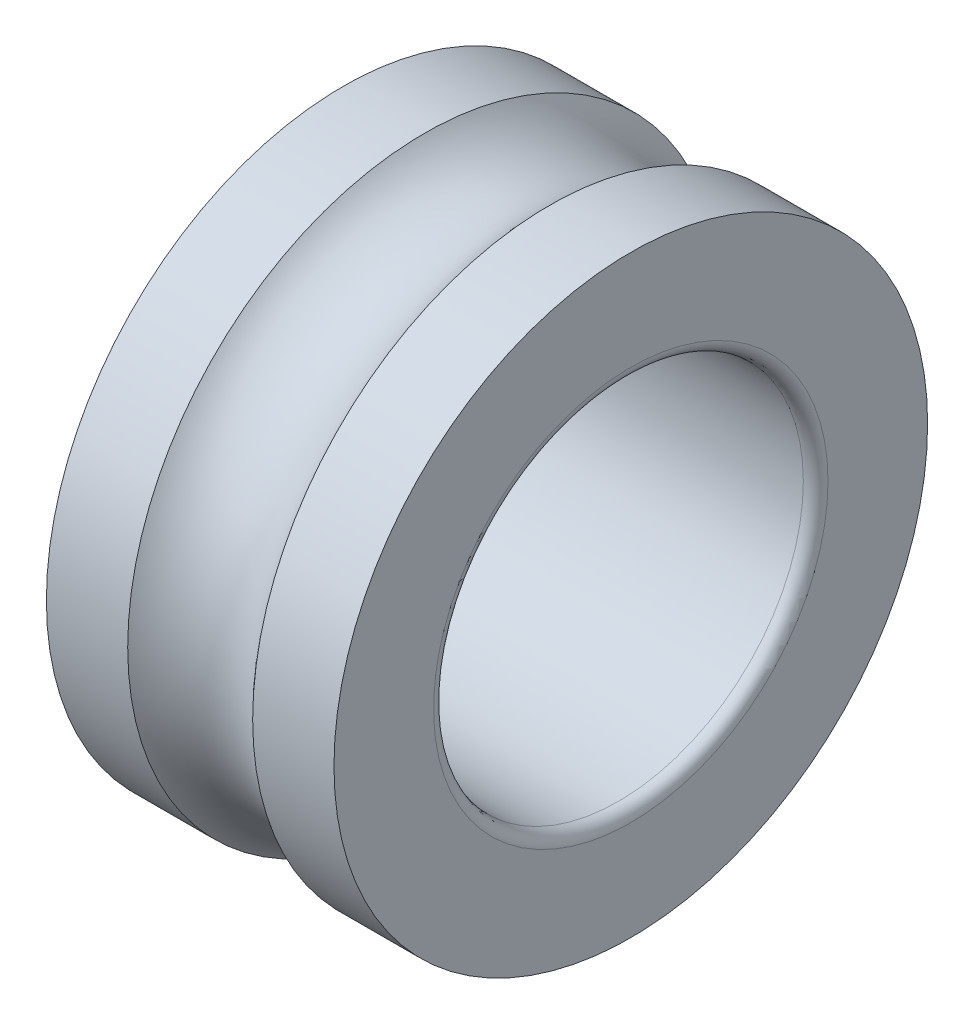
ISO-10303-21;
HEADER;
FILE_DESCRIPTION(('STEP AP214'),'2;1');
FILE_NAME('part.step','',(''),(''),'','','');
FILE_SCHEMA(('AUTOMOTIVE_DESIGN { 1 0 10303 214 1 1 1 1 }'));
ENDSEC;
DATA;
#1=APPLICATION_CONTEXT('core data for automotive mechanical design processes');
#2=APPLICATION_PROTOCOL_DEFINITION('international standard','automotive_design',2000,#1);
#3=PRODUCT_CONTEXT('',#1,'mechanical');
#4=PRODUCT('Part','Part','',(#3));
#5=PRODUCT_RELATED_PRODUCT_CATEGORY('part','',(#4));
#6=PRODUCT_DEFINITION_FORMATION('','',#4);
#7=PRODUCT_DEFINITION_CONTEXT('part definition',#1,'design');
#8=PRODUCT_DEFINITION('design','',#6,#7);
#9=PRODUCT_DEFINITION_SHAPE('','',#8);
#10=(LENGTH_UNIT() NAMED_UNIT(*) SI_UNIT(.MILLI.,.METRE.));
#11=(NAMED_UNIT(*) PLANE_ANGLE_UNIT() SI_UNIT($,.RADIAN.));
#12=(NAMED_UNIT(*) SI_UNIT($,.STERADIAN.) SOLID_ANGLE_UNIT());
#13=UNCERTAINTY_MEASURE_WITH_UNIT(LENGTH_MEASURE(1.E-05),#10,'distance_accuracy_value','');
#14=(GEOMETRIC_REPRESENTATION_CONTEXT(3) GLOBAL_UNCERTAINTY_ASSIGNED_CONTEXT((#13)) GLOBAL_UNIT_ASSIGNED_CONTEXT((#10,
#11,#12)) REPRESENTATION_CONTEXT('',''));
#15=CARTESIAN_POINT('',(0.,0.,0.));
#16=DIRECTION('',(0.,0.,1.));
#17=DIRECTION('',(1.,0.,0.));
#18=AXIS2_PLACEMENT_3D('',#15,#16,#17);
#19=CARTESIAN_POINT('',(0.,7.225,0.));
#20=DIRECTION('',(-1.,0.,0.));
#21=DIRECTION('',(0.,0.,1.));
#22=AXIS2_PLACEMENT_3D('',#19,#20,#21);
#23=PLANE('',#22);
#24=CARTESIAN_POINT('',(0.,0.,0.));
#25=DIRECTION('',(1.,0.,0.));
#26=DIRECTION('',(0.,0.,-1.));
#27=AXIS2_PLACEMENT_3D('',#24,#25,#26);
#28=CIRCLE('',#27,7.225);
#29=CARTESIAN_POINT('',(0.,0.,-7.225));
#30=VERTEX_POINT('',#29);
#31=EDGE_CURVE('E38',#30,#30,#28,.T.);
#32=ORIENTED_EDGE('',*,*,#31,.F.);
#33=EDGE_LOOP('',(#32));
#34=FACE_BOUND('',#33,.T.);
#35=CARTESIAN_POINT('',(0.,0.,0.));
#36=DIRECTION('',(1.,0.,0.));
#37=DIRECTION('',(0.,0.,-1.));
#38=AXIS2_PLACEMENT_3D('',#35,#36,#37);
#39=CIRCLE('',#38,4.8);
#40=CARTESIAN_POINT('',(0.,0.,-4.8));
#41=VERTEX_POINT('',#40);
#42=EDGE_CURVE('E11',#41,#41,#39,.T.);
#43=ORIENTED_EDGE('',*,*,#42,.T.);
#44=EDGE_LOOP('',(#43));
#45=FACE_BOUND('',#44,.T.);
#46=ADVANCED_FACE('F16',(#34,#45),#23,.T.);
#47=CARTESIAN_POINT('',(0.3,0.,0.));
#48=DIRECTION('',(1.,0.,0.));
#49=DIRECTION('',(0.,0.,-1.));
#50=AXIS2_PLACEMENT_3D('',#47,#48,#49);
#51=TOROIDAL_SURFACE('',#50,4.8,0.3);
#52=ORIENTED_EDGE('',*,*,#42,.F.);
#53=EDGE_LOOP('',(#52));
#54=FACE_BOUND('',#53,.T.);
#55=CARTESIAN_POINT('',(0.3,0.,0.));
#56=DIRECTION('',(1.,0.,0.));
#57=DIRECTION('',(0.,0.,-1.));
#58=AXIS2_PLACEMENT_3D('',#55,#56,#57);
#59=CIRCLE('',#58,4.5);
#60=CARTESIAN_POINT('',(0.3,0.,-4.5));
#61=VERTEX_POINT('',#60);
#62=EDGE_CURVE('E27',#61,#61,#59,.T.);
#63=ORIENTED_EDGE('',*,*,#62,.T.);
#64=EDGE_LOOP('',(#63));
#65=FACE_BOUND('',#64,.T.);
#66=ADVANCED_FACE('F18',(#54,#65),#51,.T.);
#67=CARTESIAN_POINT('',(50.,0.,0.));
#68=DIRECTION('',(-1.,0.,0.));
#69=DIRECTION('',(0.,0.,-1.));
#70=AXIS2_PLACEMENT_3D('',#67,#68,#69);
#71=CYLINDRICAL_SURFACE('',#70,4.5);
#72=ORIENTED_EDGE('',*,*,#62,.F.);
#73=EDGE_LOOP('',(#72));
#74=FACE_BOUND('',#73,.T.);
#75=CARTESIAN_POINT('',(6.7,0.,0.));
#76=DIRECTION('',(1.,0.,0.));
#77=DIRECTION('',(0.,0.,-1.));
#78=AXIS2_PLACEMENT_3D('',#75,#76,#77);
#79=CIRCLE('',#78,4.5);
#80=CARTESIAN_POINT('',(6.7,0.,-4.5));
#81=VERTEX_POINT('',#80);
#82=EDGE_CURVE('E69',#81,#81,#79,.T.);
#83=ORIENTED_EDGE('',*,*,#82,.T.);
#84=EDGE_LOOP('',(#83));
#85=FACE_BOUND('',#84,.T.);
#86=ADVANCED_FACE('F115',(#74,#85),#71,.F.);
#87=CARTESIAN_POINT('',(6.7,0.,0.));
#88=DIRECTION('',(1.,0.,0.));
#89=DIRECTION('',(0.,0.,-1.));
#90=AXIS2_PLACEMENT_3D('',#87,#88,#89);
#91=TOROIDAL_SURFACE('',#90,4.8,0.3);
#92=ORIENTED_EDGE('',*,*,#82,.F.);
#93=EDGE_LOOP('',(#92));
#94=FACE_BOUND('',#93,.T.);
#95=CARTESIAN_POINT('',(7.,0.,0.));
#96=DIRECTION('',(1.,0.,0.));
#97=DIRECTION('',(0.,0.,-1.));
#98=AXIS2_PLACEMENT_3D('',#95,#96,#97);
#99=CIRCLE('',#98,4.8);
#100=CARTESIAN_POINT('',(7.,0.,-4.8));
#101=VERTEX_POINT('',#100);
#102=EDGE_CURVE('E20',#101,#101,#99,.T.);
#103=ORIENTED_EDGE('',*,*,#102,.T.);
#104=EDGE_LOOP('',(#103));
#105=FACE_BOUND('',#104,.T.);
#106=ADVANCED_FACE('F123',(#94,#105),#91,.T.);
#107=CARTESIAN_POINT('',(7.,4.8,0.));
#108=DIRECTION('',(1.,0.,0.));
#109=DIRECTION('',(0.,1.,0.));
#110=AXIS2_PLACEMENT_3D('',#107,#108,#109);
#111=PLANE('',#110);
#112=CARTESIAN_POINT('',(7.,0.,0.));
#113=DIRECTION('',(1.,0.,0.));
#114=DIRECTION('',(0.,0.,-1.));
#115=AXIS2_PLACEMENT_3D('',#112,#113,#114);
#116=CIRCLE('',#115,7.225);
#117=CARTESIAN_POINT('',(7.,0.,-7.225));
#118=VERTEX_POINT('',#117);
#119=EDGE_CURVE('E70',#118,#118,#116,.T.);
#120=ORIENTED_EDGE('',*,*,#119,.T.);
#121=EDGE_LOOP('',(#120));
#122=FACE_BOUND('',#121,.T.);
#123=ORIENTED_EDGE('',*,*,#102,.F.);
#124=EDGE_LOOP('',(#123));
#125=FACE_BOUND('',#124,.T.);
#126=ADVANCED_FACE('F66',(#122,#125),#111,.T.);
#127=CARTESIAN_POINT('',(50.,0.,0.));
#128=DIRECTION('',(-1.,0.,0.));
#129=DIRECTION('',(0.,0.,-1.));
#130=AXIS2_PLACEMENT_3D('',#127,#128,#129);
#131=CYLINDRICAL_SURFACE('',#130,7.225);
#132=ORIENTED_EDGE('',*,*,#119,.F.);
#133=EDGE_LOOP('',(#132));
#134=FACE_BOUND('',#133,.T.);
#135=CARTESIAN_POINT('',(5.020728526069,0.,0.));
#136=DIRECTION('',(1.,0.,0.));
#137=DIRECTION('',(0.,0.,-1.));
#138=AXIS2_PLACEMENT_3D('',#135,#136,#137);
#139=CIRCLE('',#138,7.225);
#140=CARTESIAN_POINT('',(5.020728526069,0.,-7.225));
#141=VERTEX_POINT('',#140);
#142=EDGE_CURVE('E77',#141,#141,#139,.T.);
#143=ORIENTED_EDGE('',*,*,#142,.T.);
#144=EDGE_LOOP('',(#143));
#145=FACE_BOUND('',#144,.T.);
#146=ADVANCED_FACE('F107',(#134,#145),#131,.T.);
#147=CARTESIAN_POINT('',(3.5,0.,0.));
#148=DIRECTION('',(1.,0.,0.));
#149=DIRECTION('',(0.,0.,-1.));
#150=AXIS2_PLACEMENT_3D('',#147,#148,#149);
#151=TOROIDAL_SURFACE('',#150,8.5,1.9845);
#152=CARTESIAN_POINT('',(1.979271473931,0.,0.));
#153=DIRECTION('',(1.,0.,0.));
#154=DIRECTION('',(0.,0.,-1.));
#155=AXIS2_PLACEMENT_3D('',#152,#153,#154);
#156=CIRCLE('',#155,7.225);
#157=CARTESIAN_POINT('',(1.979271473931,0.,-7.225));
#158=VERTEX_POINT('',#157);
#159=EDGE_CURVE('E84',#158,#158,#156,.T.);
#160=ORIENTED_EDGE('',*,*,#159,.T.);
#161=EDGE_LOOP('',(#160));
#162=FACE_BOUND('',#161,.T.);
#163=ORIENTED_EDGE('',*,*,#142,.F.);
#164=EDGE_LOOP('',(#163));
#165=FACE_BOUND('',#164,.T.);
#166=ADVANCED_FACE('F97',(#162,#165),#151,.F.);
#167=CARTESIAN_POINT('',(50.,0.,0.));
#168=DIRECTION('',(-1.,0.,0.));
#169=DIRECTION('',(0.,0.,-1.));
#170=AXIS2_PLACEMENT_3D('',#167,#168,#169);
#171=CYLINDRICAL_SURFACE('',#170,7.225);
#172=ORIENTED_EDGE('',*,*,#159,.F.);
#173=EDGE_LOOP('',(#172));
#174=FACE_BOUND('',#173,.T.);
#175=ORIENTED_EDGE('',*,*,#31,.T.);
#176=EDGE_LOOP('',(#175));
#177=FACE_BOUND('',#176,.T.);
#178=ADVANCED_FACE('F100',(#174,#177),#171,.T.);
#179=CLOSED_SHELL('',(#46,#66,#86,#106,#126,#146,#166,#178));
#180=MANIFOLD_SOLID_BREP('B1',#179);
#181=ADVANCED_BREP_SHAPE_REPRESENTATION('',(#18,#180),#14);
#182=SHAPE_DEFINITION_REPRESENTATION(#9,#181);
ENDSEC;
END-ISO-10303-21;
